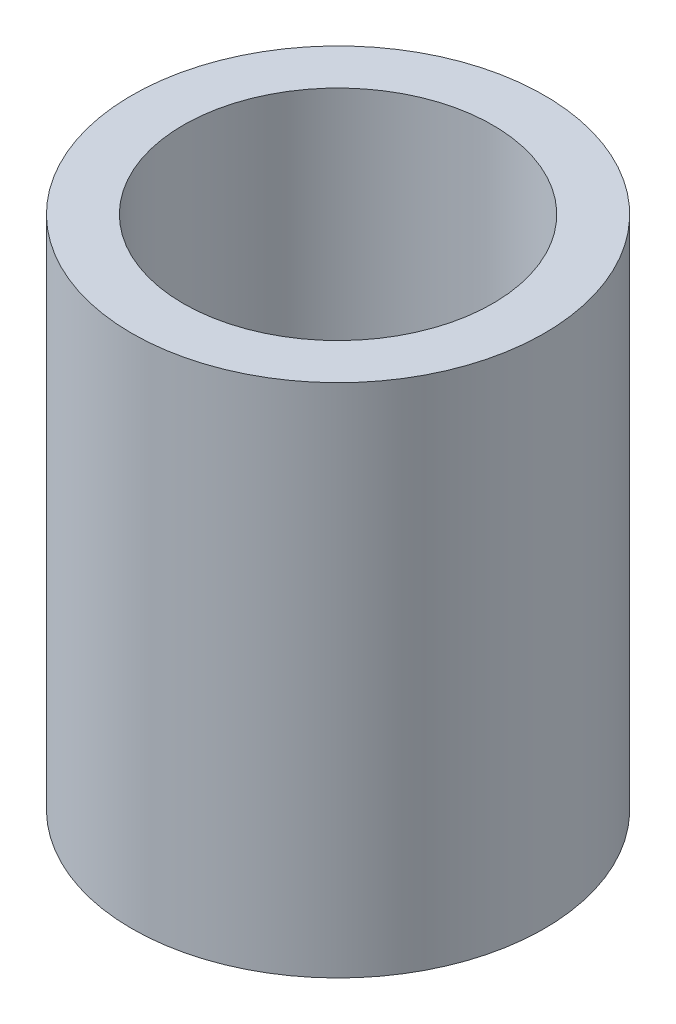
ISO-10303-21;
HEADER;
FILE_DESCRIPTION(('STEP AP214'),'2;1');
FILE_NAME('part.step','',(''),(''),'','','');
FILE_SCHEMA(('AUTOMOTIVE_DESIGN { 1 0 10303 214 1 1 1 1 }'));
ENDSEC;
DATA;
#1=APPLICATION_CONTEXT('core data for automotive mechanical design processes');
#2=APPLICATION_PROTOCOL_DEFINITION('international standard','automotive_design',2000,#1);
#3=PRODUCT_CONTEXT('',#1,'mechanical');
#4=PRODUCT('Part','Part','',(#3));
#5=PRODUCT_RELATED_PRODUCT_CATEGORY('part','',(#4));
#6=PRODUCT_DEFINITION_FORMATION('','',#4);
#7=PRODUCT_DEFINITION_CONTEXT('part definition',#1,'design');
#8=PRODUCT_DEFINITION('design','',#6,#7);
#9=PRODUCT_DEFINITION_SHAPE('','',#8);
#10=(LENGTH_UNIT() NAMED_UNIT(*) SI_UNIT(.MILLI.,.METRE.));
#11=(NAMED_UNIT(*) PLANE_ANGLE_UNIT() SI_UNIT($,.RADIAN.));
#12=(NAMED_UNIT(*) SI_UNIT($,.STERADIAN.) SOLID_ANGLE_UNIT());
#13=UNCERTAINTY_MEASURE_WITH_UNIT(LENGTH_MEASURE(1.E-05),#10,'distance_accuracy_value','');
#14=(GEOMETRIC_REPRESENTATION_CONTEXT(3) GLOBAL_UNCERTAINTY_ASSIGNED_CONTEXT((#13)) GLOBAL_UNIT_ASSIGNED_CONTEXT((#10,
#11,#12)) REPRESENTATION_CONTEXT('',''));
#15=CARTESIAN_POINT('',(0.,0.,0.));
#16=DIRECTION('',(0.,0.,1.));
#17=DIRECTION('',(1.,0.,0.));
#18=AXIS2_PLACEMENT_3D('',#15,#16,#17);
#19=CARTESIAN_POINT('',(0.,20.,0.));
#20=DIRECTION('',(0.,1.,0.));
#21=DIRECTION('',(0.,0.,1.));
#22=AXIS2_PLACEMENT_3D('',#19,#20,#21);
#23=PLANE('',#22);
#24=CARTESIAN_POINT('',(0.,20.,0.));
#25=DIRECTION('',(0.,1.,0.));
#26=DIRECTION('',(0.,0.,1.));
#27=AXIS2_PLACEMENT_3D('',#24,#25,#26);
#28=CIRCLE('',#27,8.);
#29=CARTESIAN_POINT('',(0.,20.,8.));
#30=VERTEX_POINT('',#29);
#31=EDGE_CURVE('E10',#30,#30,#28,.T.);
#32=ORIENTED_EDGE('',*,*,#31,.T.);
#33=EDGE_LOOP('',(#32));
#34=FACE_BOUND('',#33,.T.);
#35=CARTESIAN_POINT('',(0.,20.,0.));
#36=DIRECTION('',(0.,1.,0.));
#37=DIRECTION('',(0.,0.,1.));
#38=AXIS2_PLACEMENT_3D('',#35,#36,#37);
#39=CIRCLE('',#38,6.);
#40=CARTESIAN_POINT('',(0.,20.,6.));
#41=VERTEX_POINT('',#40);
#42=EDGE_CURVE('E40',#41,#41,#39,.T.);
#43=ORIENTED_EDGE('',*,*,#42,.F.);
#44=EDGE_LOOP('',(#43));
#45=FACE_BOUND('',#44,.T.);
#46=ADVANCED_FACE('F29',(#34,#45),#23,.T.);
#47=CARTESIAN_POINT('',(0.,0.,0.));
#48=DIRECTION('',(0.,1.,0.));
#49=DIRECTION('',(0.,0.,1.));
#50=AXIS2_PLACEMENT_3D('',#47,#48,#49);
#51=PLANE('',#50);
#52=CARTESIAN_POINT('',(0.,0.,0.));
#53=DIRECTION('',(0.,1.,0.));
#54=DIRECTION('',(0.,0.,1.));
#55=AXIS2_PLACEMENT_3D('',#52,#53,#54);
#56=CIRCLE('',#55,8.);
#57=CARTESIAN_POINT('',(0.,0.,8.));
#58=VERTEX_POINT('',#57);
#59=EDGE_CURVE('E33',#58,#58,#56,.T.);
#60=ORIENTED_EDGE('',*,*,#59,.F.);
#61=EDGE_LOOP('',(#60));
#62=FACE_BOUND('',#61,.T.);
#63=CARTESIAN_POINT('',(0.,0.,0.));
#64=DIRECTION('',(0.,1.,0.));
#65=DIRECTION('',(0.,0.,1.));
#66=AXIS2_PLACEMENT_3D('',#63,#64,#65);
#67=CIRCLE('',#66,6.);
#68=CARTESIAN_POINT('',(0.,0.,6.));
#69=VERTEX_POINT('',#68);
#70=EDGE_CURVE('E42',#69,#69,#67,.T.);
#71=ORIENTED_EDGE('',*,*,#70,.T.);
#72=EDGE_LOOP('',(#71));
#73=FACE_BOUND('',#72,.T.);
#74=ADVANCED_FACE('F52',(#62,#73),#51,.F.);
#75=CARTESIAN_POINT('',(0.,20.,0.));
#76=DIRECTION('',(0.,-1.,0.));
#77=DIRECTION('',(0.,0.,-1.));
#78=AXIS2_PLACEMENT_3D('',#75,#76,#77);
#79=CYLINDRICAL_SURFACE('',#78,8.);
#80=ORIENTED_EDGE('',*,*,#31,.F.);
#81=EDGE_LOOP('',(#80));
#82=FACE_BOUND('',#81,.T.);
#83=ORIENTED_EDGE('',*,*,#59,.T.);
#84=EDGE_LOOP('',(#83));
#85=FACE_BOUND('',#84,.T.);
#86=ADVANCED_FACE('F31',(#82,#85),#79,.T.);
#87=CARTESIAN_POINT('',(0.,20.,0.));
#88=DIRECTION('',(0.,-1.,0.));
#89=DIRECTION('',(0.,0.,-1.));
#90=AXIS2_PLACEMENT_3D('',#87,#88,#89);
#91=CYLINDRICAL_SURFACE('',#90,6.);
#92=ORIENTED_EDGE('',*,*,#42,.T.);
#93=EDGE_LOOP('',(#92));
#94=FACE_BOUND('',#93,.T.);
#95=ORIENTED_EDGE('',*,*,#70,.F.);
#96=EDGE_LOOP('',(#95));
#97=FACE_BOUND('',#96,.T.);
#98=ADVANCED_FACE('F48',(#94,#97),#91,.F.);
#99=CLOSED_SHELL('',(#46,#74,#86,#98));
#100=MANIFOLD_SOLID_BREP('B2',#99);
#101=ADVANCED_BREP_SHAPE_REPRESENTATION('',(#18,#100),#14);
#102=SHAPE_DEFINITION_REPRESENTATION(#9,#101);
ENDSEC;
END-ISO-10303-21;
